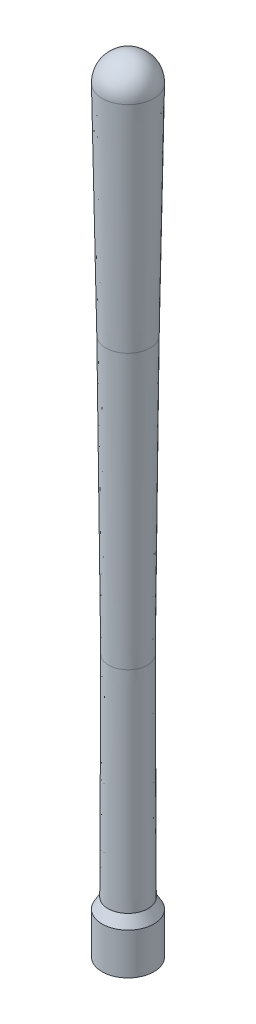
ISO-10303-21;
HEADER;
FILE_DESCRIPTION(('STEP AP214'),'2;1');
FILE_NAME('part.step','',(''),(''),'','','');
FILE_SCHEMA(('AUTOMOTIVE_DESIGN { 1 0 10303 214 1 1 1 1 }'));
ENDSEC;
DATA;
#1=APPLICATION_CONTEXT('core data for automotive mechanical design processes');
#2=APPLICATION_PROTOCOL_DEFINITION('international standard','automotive_design',2000,#1);
#3=PRODUCT_CONTEXT('',#1,'mechanical');
#4=PRODUCT('Part','Part','',(#3));
#5=PRODUCT_RELATED_PRODUCT_CATEGORY('part','',(#4));
#6=PRODUCT_DEFINITION_FORMATION('','',#4);
#7=PRODUCT_DEFINITION_CONTEXT('part definition',#1,'design');
#8=PRODUCT_DEFINITION('design','',#6,#7);
#9=PRODUCT_DEFINITION_SHAPE('','',#8);
#10=(LENGTH_UNIT() NAMED_UNIT(*) SI_UNIT(.MILLI.,.METRE.));
#11=(NAMED_UNIT(*) PLANE_ANGLE_UNIT() SI_UNIT($,.RADIAN.));
#12=(NAMED_UNIT(*) SI_UNIT($,.STERADIAN.) SOLID_ANGLE_UNIT());
#13=UNCERTAINTY_MEASURE_WITH_UNIT(LENGTH_MEASURE(1.E-05),#10,'distance_accuracy_value','');
#14=(GEOMETRIC_REPRESENTATION_CONTEXT(3) GLOBAL_UNCERTAINTY_ASSIGNED_CONTEXT((#13)) GLOBAL_UNIT_ASSIGNED_CONTEXT((#10,
#11,#12)) REPRESENTATION_CONTEXT('',''));
#15=CARTESIAN_POINT('',(0.,0.,0.));
#16=DIRECTION('',(0.,0.,1.));
#17=DIRECTION('',(1.,0.,0.));
#18=AXIS2_PLACEMENT_3D('',#15,#16,#17);
#19=CARTESIAN_POINT('',(0.,-8.,0.));
#20=DIRECTION('',(0.,-1.,0.));
#21=DIRECTION('',(0.,0.,-1.));
#22=AXIS2_PLACEMENT_3D('',#19,#20,#21);
#23=PLANE('',#22);
#24=CARTESIAN_POINT('',(0.,-8.,0.));
#25=DIRECTION('',(0.,-1.,0.));
#26=DIRECTION('',(0.,0.,-1.));
#27=AXIS2_PLACEMENT_3D('',#24,#25,#26);
#28=CIRCLE('',#27,4.5);
#29=CARTESIAN_POINT('',(0.,-8.,-4.5));
#30=VERTEX_POINT('',#29);
#31=EDGE_CURVE('E34',#30,#30,#28,.T.);
#32=ORIENTED_EDGE('',*,*,#31,.T.);
#33=EDGE_LOOP('',(#32));
#34=FACE_BOUND('',#33,.T.);
#35=ADVANCED_FACE('F31',(#34),#23,.T.);
#36=CARTESIAN_POINT('',(0.,-8.,0.));
#37=DIRECTION('',(0.,1.,0.));
#38=DIRECTION('',(0.,0.,1.));
#39=AXIS2_PLACEMENT_3D('',#36,#37,#38);
#40=CONICAL_SURFACE('',#39,4.5,0.982793723247329);
#41=CARTESIAN_POINT('',(0.,-6.,0.));
#42=DIRECTION('',(0.,-1.,0.));
#43=DIRECTION('',(0.,0.,-1.));
#44=AXIS2_PLACEMENT_3D('',#41,#42,#43);
#45=CIRCLE('',#44,7.5);
#46=CARTESIAN_POINT('',(0.,-6.,-7.5));
#47=VERTEX_POINT('',#46);
#48=EDGE_CURVE('E42',#47,#47,#45,.T.);
#49=ORIENTED_EDGE('',*,*,#48,.T.);
#50=EDGE_LOOP('',(#49));
#51=FACE_BOUND('',#50,.T.);
#52=ORIENTED_EDGE('',*,*,#31,.F.);
#53=EDGE_LOOP('',(#52));
#54=FACE_BOUND('',#53,.T.);
#55=ADVANCED_FACE('F58',(#51,#54),#40,.T.);
#56=CARTESIAN_POINT('',(0.,-12.,0.));
#57=DIRECTION('',(0.,-1.,0.));
#58=DIRECTION('',(0.,0.,-1.));
#59=AXIS2_PLACEMENT_3D('',#56,#57,#58);
#60=CYLINDRICAL_SURFACE('',#59,7.5);
#61=CARTESIAN_POINT('',(0.,6.,0.));
#62=DIRECTION('',(0.,-1.,0.));
#63=DIRECTION('',(0.,0.,-1.));
#64=AXIS2_PLACEMENT_3D('',#61,#62,#63);
#65=CIRCLE('',#64,7.5);
#66=CARTESIAN_POINT('',(0.,6.,-7.5));
#67=VERTEX_POINT('',#66);
#68=EDGE_CURVE('E53',#67,#67,#65,.T.);
#69=ORIENTED_EDGE('',*,*,#68,.T.);
#70=EDGE_LOOP('',(#69));
#71=FACE_BOUND('',#70,.T.);
#72=ORIENTED_EDGE('',*,*,#48,.F.);
#73=EDGE_LOOP('',(#72));
#74=FACE_BOUND('',#73,.T.);
#75=ADVANCED_FACE('F61',(#71,#74),#60,.T.);
#76=CARTESIAN_POINT('',(0.,6.,0.));
#77=DIRECTION('',(0.,-1.,0.));
#78=DIRECTION('',(0.,0.,-1.));
#79=AXIS2_PLACEMENT_3D('',#76,#77,#78);
#80=CONICAL_SURFACE('',#79,7.5,0.515549007458979);
#81=CARTESIAN_POINT('',(0.,9.,0.));
#82=DIRECTION('',(0.,-1.,0.));
#83=DIRECTION('',(0.,0.,-1.));
#84=AXIS2_PLACEMENT_3D('',#81,#82,#83);
#85=CIRCLE('',#84,5.8);
#86=CARTESIAN_POINT('',(0.,9.,-5.8));
#87=VERTEX_POINT('',#86);
#88=EDGE_CURVE('E50',#87,#87,#85,.T.);
#89=ORIENTED_EDGE('',*,*,#88,.T.);
#90=EDGE_LOOP('',(#89));
#91=FACE_BOUND('',#90,.T.);
#92=ORIENTED_EDGE('',*,*,#68,.F.);
#93=EDGE_LOOP('',(#92));
#94=FACE_BOUND('',#93,.T.);
#95=ADVANCED_FACE('F63',(#91,#94),#80,.T.);
#96=CARTESIAN_POINT('',(0.,9.,0.));
#97=DIRECTION('',(0.,-1.,0.));
#98=DIRECTION('',(0.,0.,-1.));
#99=AXIS2_PLACEMENT_3D('',#96,#97,#98);
#100=CONICAL_SURFACE('',#99,5.8,0.00327867677625234);
#101=CARTESIAN_POINT('',(0.,70.,0.));
#102=DIRECTION('',(0.,-1.,0.));
#103=DIRECTION('',(0.,0.,-1.));
#104=AXIS2_PLACEMENT_3D('',#101,#102,#103);
#105=CIRCLE('',#104,5.6);
#106=CARTESIAN_POINT('',(0.,70.,-5.6));
#107=VERTEX_POINT('',#106);
#108=EDGE_CURVE('E47',#107,#107,#105,.T.);
#109=ORIENTED_EDGE('',*,*,#108,.T.);
#110=EDGE_LOOP('',(#109));
#111=FACE_BOUND('',#110,.T.);
#112=ORIENTED_EDGE('',*,*,#88,.F.);
#113=EDGE_LOOP('',(#112));
#114=FACE_BOUND('',#113,.T.);
#115=ADVANCED_FACE('F70',(#111,#114),#100,.T.);
#116=CARTESIAN_POINT('',(0.,70.,0.));
#117=DIRECTION('',(0.,1.,0.));
#118=DIRECTION('',(0.,0.,1.));
#119=AXIS2_PLACEMENT_3D('',#116,#117,#118);
#120=CONICAL_SURFACE('',#119,5.6,0.00999966668666524);
#121=CARTESIAN_POINT('',(0.,150.,0.));
#122=DIRECTION('',(0.,-1.,0.));
#123=DIRECTION('',(0.,0.,-1.));
#124=AXIS2_PLACEMENT_3D('',#121,#122,#123);
#125=CIRCLE('',#124,6.4);
#126=CARTESIAN_POINT('',(0.,150.,-6.4));
#127=VERTEX_POINT('',#126);
#128=EDGE_CURVE('E44',#127,#127,#125,.T.);
#129=ORIENTED_EDGE('',*,*,#128,.T.);
#130=EDGE_LOOP('',(#129));
#131=FACE_BOUND('',#130,.T.);
#132=ORIENTED_EDGE('',*,*,#108,.F.);
#133=EDGE_LOOP('',(#132));
#134=FACE_BOUND('',#133,.T.);
#135=ADVANCED_FACE('F101',(#131,#134),#120,.T.);
#136=CARTESIAN_POINT('',(0.,150.,0.));
#137=DIRECTION('',(0.,1.,0.));
#138=DIRECTION('',(0.,0.,1.));
#139=AXIS2_PLACEMENT_3D('',#136,#137,#138);
#140=CONICAL_SURFACE('',#139,6.4,0.0173417279898924);
#141=CARTESIAN_POINT('',(0.,213.164385933934,0.));
#142=DIRECTION('',(0.,1.,0.));
#143=DIRECTION('',(0.,0.,1.));
#144=AXIS2_PLACEMENT_3D('',#141,#142,#143);
#145=CIRCLE('',#144,7.49548941924691);
#146=CARTESIAN_POINT('',(0.,213.164385933934,7.49548941924691));
#147=VERTEX_POINT('',#146);
#148=EDGE_CURVE('E10',#147,#147,#145,.T.);
#149=ORIENTED_EDGE('',*,*,#148,.F.);
#150=EDGE_LOOP('',(#149));
#151=FACE_BOUND('',#150,.T.);
#152=ORIENTED_EDGE('',*,*,#128,.F.);
#153=EDGE_LOOP('',(#152));
#154=FACE_BOUND('',#153,.T.);
#155=ADVANCED_FACE('F111',(#151,#154),#140,.T.);
#156=CARTESIAN_POINT('',(0.,213.42445970413,0.));
#157=DIRECTION('',(0.,-1.,0.));
#158=DIRECTION('',(-1.,0.,0.));
#159=AXIS2_PLACEMENT_3D('',#156,#157,#158);
#160=SPHERICAL_SURFACE('',#159,7.49999999999999);
#161=ORIENTED_EDGE('',*,*,#148,.T.);
#162=EDGE_LOOP('',(#161));
#163=FACE_BOUND('',#162,.T.);
#164=ADVANCED_FACE('F121',(#163),#160,.T.);
#165=CLOSED_SHELL('',(#35,#55,#75,#95,#115,#135,#155,#164));
#166=MANIFOLD_SOLID_BREP('B2',#165);
#167=ADVANCED_BREP_SHAPE_REPRESENTATION('',(#18,#166),#14);
#168=SHAPE_DEFINITION_REPRESENTATION(#9,#167);
ENDSEC;
END-ISO-10303-21;
